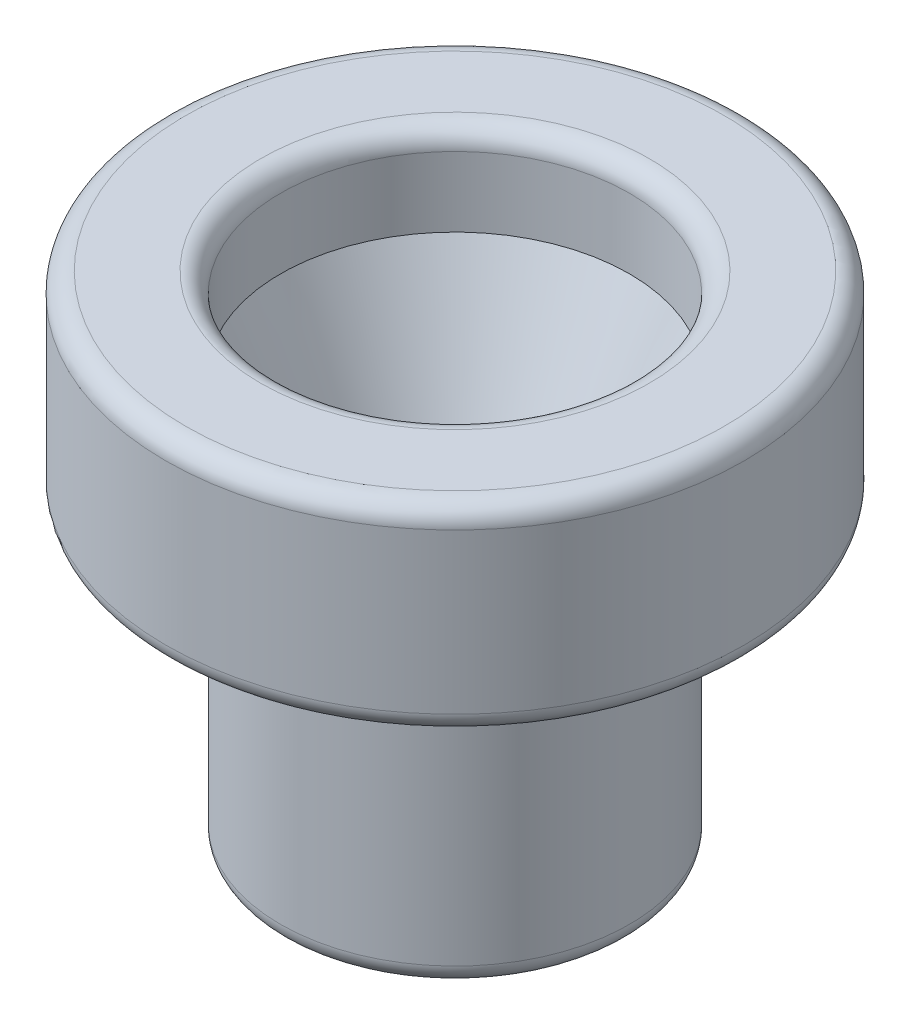
ISO-10303-21;
HEADER;
FILE_DESCRIPTION(('STEP AP214'),'2;1');
FILE_NAME('part.step','',(''),(''),'','','');
FILE_SCHEMA(('AUTOMOTIVE_DESIGN { 1 0 10303 214 1 1 1 1 }'));
ENDSEC;
DATA;
#1=APPLICATION_CONTEXT('core data for automotive mechanical design processes');
#2=APPLICATION_PROTOCOL_DEFINITION('international standard','automotive_design',2000,#1);
#3=PRODUCT_CONTEXT('',#1,'mechanical');
#4=PRODUCT('Part','Part','',(#3));
#5=PRODUCT_RELATED_PRODUCT_CATEGORY('part','',(#4));
#6=PRODUCT_DEFINITION_FORMATION('','',#4);
#7=PRODUCT_DEFINITION_CONTEXT('part definition',#1,'design');
#8=PRODUCT_DEFINITION('design','',#6,#7);
#9=PRODUCT_DEFINITION_SHAPE('','',#8);
#10=(LENGTH_UNIT() NAMED_UNIT(*) SI_UNIT(.MILLI.,.METRE.));
#11=(NAMED_UNIT(*) PLANE_ANGLE_UNIT() SI_UNIT($,.RADIAN.));
#12=(NAMED_UNIT(*) SI_UNIT($,.STERADIAN.) SOLID_ANGLE_UNIT());
#13=UNCERTAINTY_MEASURE_WITH_UNIT(LENGTH_MEASURE(1.E-05),#10,'distance_accuracy_value','');
#14=(GEOMETRIC_REPRESENTATION_CONTEXT(3) GLOBAL_UNCERTAINTY_ASSIGNED_CONTEXT((#13)) GLOBAL_UNIT_ASSIGNED_CONTEXT((#10,
#11,#12)) REPRESENTATION_CONTEXT('',''));
#15=CARTESIAN_POINT('',(0.,0.,0.));
#16=DIRECTION('',(0.,0.,1.));
#17=DIRECTION('',(1.,0.,0.));
#18=AXIS2_PLACEMENT_3D('',#15,#16,#17);
#19=CARTESIAN_POINT('',(13.335,0.,0.));
#20=DIRECTION('',(0.,-1.,0.));
#21=DIRECTION('',(0.,0.,-1.));
#22=AXIS2_PLACEMENT_3D('',#19,#20,#21);
#23=PLANE('',#22);
#24=CARTESIAN_POINT('',(0.,0.,0.));
#25=DIRECTION('',(0.,-1.,0.));
#26=DIRECTION('',(0.,0.,-1.));
#27=AXIS2_PLACEMENT_3D('',#24,#25,#26);
#28=CIRCLE('',#27,19.685);
#29=CARTESIAN_POINT('',(0.,0.,-19.685));
#30=VERTEX_POINT('',#29);
#31=EDGE_CURVE('E85',#30,#30,#28,.T.);
#32=ORIENTED_EDGE('',*,*,#31,.T.);
#33=EDGE_LOOP('',(#32));
#34=FACE_BOUND('',#33,.T.);
#35=CARTESIAN_POINT('',(0.,0.,0.));
#36=DIRECTION('',(0.,-1.,0.));
#37=DIRECTION('',(0.,0.,-1.));
#38=AXIS2_PLACEMENT_3D('',#35,#36,#37);
#39=CIRCLE('',#38,13.335);
#40=CARTESIAN_POINT('',(0.,0.,-13.335));
#41=VERTEX_POINT('',#40);
#42=EDGE_CURVE('E97',#41,#41,#39,.T.);
#43=ORIENTED_EDGE('',*,*,#42,.F.);
#44=EDGE_LOOP('',(#43));
#45=FACE_BOUND('',#44,.T.);
#46=ADVANCED_FACE('F41',(#34,#45),#23,.T.);
#47=CARTESIAN_POINT('',(0.,0.,0.));
#48=DIRECTION('',(0.,-1.,0.));
#49=DIRECTION('',(0.,0.,-1.));
#50=AXIS2_PLACEMENT_3D('',#47,#48,#49);
#51=CYLINDRICAL_SURFACE('',#50,22.225);
#52=CARTESIAN_POINT('',(0.,2.54,0.));
#53=DIRECTION('',(0.,-1.,0.));
#54=DIRECTION('',(0.,0.,-1.));
#55=AXIS2_PLACEMENT_3D('',#52,#53,#54);
#56=CIRCLE('',#55,22.225);
#57=CARTESIAN_POINT('',(0.,2.54,-22.225));
#58=VERTEX_POINT('',#57);
#59=EDGE_CURVE('E81',#58,#58,#56,.F.);
#60=ORIENTED_EDGE('',*,*,#59,.T.);
#61=EDGE_LOOP('',(#60));
#62=FACE_BOUND('',#61,.T.);
#63=CARTESIAN_POINT('',(0.,38.1,0.));
#64=DIRECTION('',(0.,-1.,0.));
#65=DIRECTION('',(0.,0.,-1.));
#66=AXIS2_PLACEMENT_3D('',#63,#64,#65);
#67=CIRCLE('',#66,22.225);
#68=CARTESIAN_POINT('',(0.,38.1,-22.225));
#69=VERTEX_POINT('',#68);
#70=EDGE_CURVE('E89',#69,#69,#67,.T.);
#71=ORIENTED_EDGE('',*,*,#70,.T.);
#72=EDGE_LOOP('',(#71));
#73=FACE_BOUND('',#72,.T.);
#74=ADVANCED_FACE('F105',(#62,#73),#51,.T.);
#75=CARTESIAN_POINT('',(22.225,38.1,0.));
#76=DIRECTION('',(0.,-1.,0.));
#77=DIRECTION('',(0.,0.,-1.));
#78=AXIS2_PLACEMENT_3D('',#75,#76,#77);
#79=PLANE('',#78);
#80=CARTESIAN_POINT('',(0.,38.1,0.));
#81=DIRECTION('',(0.,-1.,0.));
#82=DIRECTION('',(0.,0.,-1.));
#83=AXIS2_PLACEMENT_3D('',#80,#81,#82);
#84=CIRCLE('',#83,34.29);
#85=CARTESIAN_POINT('',(0.,38.1,-34.29));
#86=VERTEX_POINT('',#85);
#87=EDGE_CURVE('E77',#86,#86,#84,.T.);
#88=ORIENTED_EDGE('',*,*,#87,.T.);
#89=EDGE_LOOP('',(#88));
#90=FACE_BOUND('',#89,.T.);
#91=ORIENTED_EDGE('',*,*,#70,.F.);
#92=EDGE_LOOP('',(#91));
#93=FACE_BOUND('',#92,.T.);
#94=ADVANCED_FACE('F111',(#90,#93),#79,.T.);
#95=CARTESIAN_POINT('',(0.,0.,0.));
#96=DIRECTION('',(0.,-1.,0.));
#97=DIRECTION('',(0.,0.,-1.));
#98=AXIS2_PLACEMENT_3D('',#95,#96,#97);
#99=CYLINDRICAL_SURFACE('',#98,36.83);
#100=CARTESIAN_POINT('',(0.,40.64,0.));
#101=DIRECTION('',(0.,-1.,0.));
#102=DIRECTION('',(0.,0.,-1.));
#103=AXIS2_PLACEMENT_3D('',#100,#101,#102);
#104=CIRCLE('',#103,36.83);
#105=CARTESIAN_POINT('',(0.,40.64,-36.83));
#106=VERTEX_POINT('',#105);
#107=EDGE_CURVE('E69',#106,#106,#104,.F.);
#108=ORIENTED_EDGE('',*,*,#107,.T.);
#109=EDGE_LOOP('',(#108));
#110=FACE_BOUND('',#109,.T.);
#111=CARTESIAN_POINT('',(0.,60.96,0.));
#112=DIRECTION('',(0.,1.,0.));
#113=DIRECTION('',(0.,0.,1.));
#114=AXIS2_PLACEMENT_3D('',#111,#112,#113);
#115=CIRCLE('',#114,36.83);
#116=CARTESIAN_POINT('',(0.,60.96,36.83));
#117=VERTEX_POINT('',#116);
#118=EDGE_CURVE('E73',#117,#117,#115,.F.);
#119=ORIENTED_EDGE('',*,*,#118,.T.);
#120=EDGE_LOOP('',(#119));
#121=FACE_BOUND('',#120,.T.);
#122=ADVANCED_FACE('F141',(#110,#121),#99,.T.);
#123=CARTESIAN_POINT('',(36.83,63.5,0.));
#124=DIRECTION('',(0.,1.,0.));
#125=DIRECTION('',(0.,0.,1.));
#126=AXIS2_PLACEMENT_3D('',#123,#124,#125);
#127=PLANE('',#126);
#128=CARTESIAN_POINT('',(0.,63.5,0.));
#129=DIRECTION('',(0.,1.,0.));
#130=DIRECTION('',(0.,0.,1.));
#131=AXIS2_PLACEMENT_3D('',#128,#129,#130);
#132=CIRCLE('',#131,24.765);
#133=CARTESIAN_POINT('',(0.,63.5,24.765));
#134=VERTEX_POINT('',#133);
#135=EDGE_CURVE('E49',#134,#134,#132,.F.);
#136=ORIENTED_EDGE('',*,*,#135,.T.);
#137=EDGE_LOOP('',(#136));
#138=FACE_BOUND('',#137,.T.);
#139=CARTESIAN_POINT('',(0.,63.5,0.));
#140=DIRECTION('',(0.,1.,0.));
#141=DIRECTION('',(0.,0.,1.));
#142=AXIS2_PLACEMENT_3D('',#139,#140,#141);
#143=CIRCLE('',#142,34.29);
#144=CARTESIAN_POINT('',(0.,63.5,34.29));
#145=VERTEX_POINT('',#144);
#146=EDGE_CURVE('E54',#145,#145,#143,.T.);
#147=ORIENTED_EDGE('',*,*,#146,.T.);
#148=EDGE_LOOP('',(#147));
#149=FACE_BOUND('',#148,.T.);
#150=ADVANCED_FACE('F143',(#138,#149),#127,.T.);
#151=CARTESIAN_POINT('',(0.,0.,0.));
#152=DIRECTION('',(0.,-1.,0.));
#153=DIRECTION('',(0.,0.,-1.));
#154=AXIS2_PLACEMENT_3D('',#151,#152,#153);
#155=CYLINDRICAL_SURFACE('',#154,22.225);
#156=CARTESIAN_POINT('',(0.,60.96,0.));
#157=DIRECTION('',(0.,1.,0.));
#158=DIRECTION('',(0.,0.,1.));
#159=AXIS2_PLACEMENT_3D('',#156,#157,#158);
#160=CIRCLE('',#159,22.225);
#161=CARTESIAN_POINT('',(0.,60.96,22.225));
#162=VERTEX_POINT('',#161);
#163=EDGE_CURVE('E10',#162,#162,#160,.T.);
#164=ORIENTED_EDGE('',*,*,#163,.T.);
#165=EDGE_LOOP('',(#164));
#166=FACE_BOUND('',#165,.T.);
#167=CARTESIAN_POINT('',(0.,52.07,0.));
#168=DIRECTION('',(0.,-1.,0.));
#169=DIRECTION('',(0.,0.,-1.));
#170=AXIS2_PLACEMENT_3D('',#167,#168,#169);
#171=CIRCLE('',#170,22.225);
#172=CARTESIAN_POINT('',(0.,52.07,-22.225));
#173=VERTEX_POINT('',#172);
#174=EDGE_CURVE('E93',#173,#173,#171,.T.);
#175=ORIENTED_EDGE('',*,*,#174,.T.);
#176=EDGE_LOOP('',(#175));
#177=FACE_BOUND('',#176,.T.);
#178=ADVANCED_FACE('F150',(#166,#177),#155,.F.);
#179=CARTESIAN_POINT('',(0.,52.07,0.));
#180=DIRECTION('',(0.,1.,0.));
#181=DIRECTION('',(0.,0.,1.));
#182=AXIS2_PLACEMENT_3D('',#179,#180,#181);
#183=CONICAL_SURFACE('',#182,22.225,0.436627159813541);
#184=CARTESIAN_POINT('',(0.,33.5306317665972,0.));
#185=DIRECTION('',(0.,-1.,0.));
#186=DIRECTION('',(0.,0.,-1.));
#187=AXIS2_PLACEMENT_3D('',#184,#185,#186);
#188=CIRCLE('',#187,13.573294824412);
#189=CARTESIAN_POINT('',(0.,33.5306317665972,-13.573294824412));
#190=VERTEX_POINT('',#189);
#191=EDGE_CURVE('E65',#190,#190,#188,.T.);
#192=ORIENTED_EDGE('',*,*,#191,.T.);
#193=EDGE_LOOP('',(#192));
#194=FACE_BOUND('',#193,.T.);
#195=ORIENTED_EDGE('',*,*,#174,.F.);
#196=EDGE_LOOP('',(#195));
#197=FACE_BOUND('',#196,.T.);
#198=ADVANCED_FACE('F156',(#194,#197),#183,.F.);
#199=CARTESIAN_POINT('',(0.,0.,0.));
#200=DIRECTION('',(0.,-1.,0.));
#201=DIRECTION('',(0.,0.,-1.));
#202=AXIS2_PLACEMENT_3D('',#199,#200,#201);
#203=CYLINDRICAL_SURFACE('',#202,13.335);
#204=CARTESIAN_POINT('',(0.,32.4565026846561,0.));
#205=DIRECTION('',(0.,1.,0.));
#206=DIRECTION('',(0.,0.,1.));
#207=AXIS2_PLACEMENT_3D('',#204,#205,#206);
#208=CIRCLE('',#207,13.335);
#209=CARTESIAN_POINT('',(0.,32.4565026846561,13.335));
#210=VERTEX_POINT('',#209);
#211=EDGE_CURVE('E59',#210,#210,#208,.T.);
#212=ORIENTED_EDGE('',*,*,#211,.T.);
#213=EDGE_LOOP('',(#212));
#214=FACE_BOUND('',#213,.T.);
#215=ORIENTED_EDGE('',*,*,#42,.T.);
#216=EDGE_LOOP('',(#215));
#217=FACE_BOUND('',#216,.T.);
#218=ADVANCED_FACE('F102',(#214,#217),#203,.F.);
#219=CARTESIAN_POINT('',(0.,2.54,0.));
#220=DIRECTION('',(0.,-1.,0.));
#221=DIRECTION('',(0.,0.,-1.));
#222=AXIS2_PLACEMENT_3D('',#219,#220,#221);
#223=TOROIDAL_SURFACE('',#222,19.685,2.54);
#224=ORIENTED_EDGE('',*,*,#59,.F.);
#225=EDGE_LOOP('',(#224));
#226=FACE_BOUND('',#225,.T.);
#227=ORIENTED_EDGE('',*,*,#31,.F.);
#228=EDGE_LOOP('',(#227));
#229=FACE_BOUND('',#228,.T.);
#230=ADVANCED_FACE('F116',(#226,#229),#223,.T.);
#231=CARTESIAN_POINT('',(0.,40.64,0.));
#232=DIRECTION('',(0.,-1.,0.));
#233=DIRECTION('',(0.,0.,-1.));
#234=AXIS2_PLACEMENT_3D('',#231,#232,#233);
#235=TOROIDAL_SURFACE('',#234,34.29,2.54);
#236=ORIENTED_EDGE('',*,*,#107,.F.);
#237=EDGE_LOOP('',(#236));
#238=FACE_BOUND('',#237,.T.);
#239=ORIENTED_EDGE('',*,*,#87,.F.);
#240=EDGE_LOOP('',(#239));
#241=FACE_BOUND('',#240,.T.);
#242=ADVANCED_FACE('F119',(#238,#241),#235,.T.);
#243=CARTESIAN_POINT('',(0.,32.4565026846561,0.));
#244=DIRECTION('',(0.,1.,0.));
#245=DIRECTION('',(0.,0.,1.));
#246=AXIS2_PLACEMENT_3D('',#243,#244,#245);
#247=TOROIDAL_SURFACE('',#246,15.875,2.54);
#248=ORIENTED_EDGE('',*,*,#211,.F.);
#249=EDGE_LOOP('',(#248));
#250=FACE_BOUND('',#249,.T.);
#251=ORIENTED_EDGE('',*,*,#191,.F.);
#252=EDGE_LOOP('',(#251));
#253=FACE_BOUND('',#252,.T.);
#254=ADVANCED_FACE('F123',(#250,#253),#247,.T.);
#255=CARTESIAN_POINT('',(0.,60.96,0.));
#256=DIRECTION('',(0.,1.,0.));
#257=DIRECTION('',(0.,0.,1.));
#258=AXIS2_PLACEMENT_3D('',#255,#256,#257);
#259=TOROIDAL_SURFACE('',#258,24.765,2.54);
#260=ORIENTED_EDGE('',*,*,#163,.F.);
#261=EDGE_LOOP('',(#260));
#262=FACE_BOUND('',#261,.T.);
#263=ORIENTED_EDGE('',*,*,#135,.F.);
#264=EDGE_LOOP('',(#263));
#265=FACE_BOUND('',#264,.T.);
#266=ADVANCED_FACE('F126',(#262,#265),#259,.T.);
#267=CARTESIAN_POINT('',(0.,60.96,0.));
#268=DIRECTION('',(0.,1.,0.));
#269=DIRECTION('',(0.,0.,1.));
#270=AXIS2_PLACEMENT_3D('',#267,#268,#269);
#271=TOROIDAL_SURFACE('',#270,34.29,2.54);
#272=ORIENTED_EDGE('',*,*,#146,.F.);
#273=EDGE_LOOP('',(#272));
#274=FACE_BOUND('',#273,.T.);
#275=ORIENTED_EDGE('',*,*,#118,.F.);
#276=EDGE_LOOP('',(#275));
#277=FACE_BOUND('',#276,.T.);
#278=ADVANCED_FACE('F43',(#274,#277),#271,.T.);
#279=CLOSED_SHELL('',(#46,#74,#94,#122,#150,#178,#198,#218,#230,#242,#254,#266,#278));
#280=MANIFOLD_SOLID_BREP('B2',#279);
#281=ADVANCED_BREP_SHAPE_REPRESENTATION('',(#18,#280),#14);
#282=SHAPE_DEFINITION_REPRESENTATION(#9,#281);
ENDSEC;
END-ISO-10303-21;
